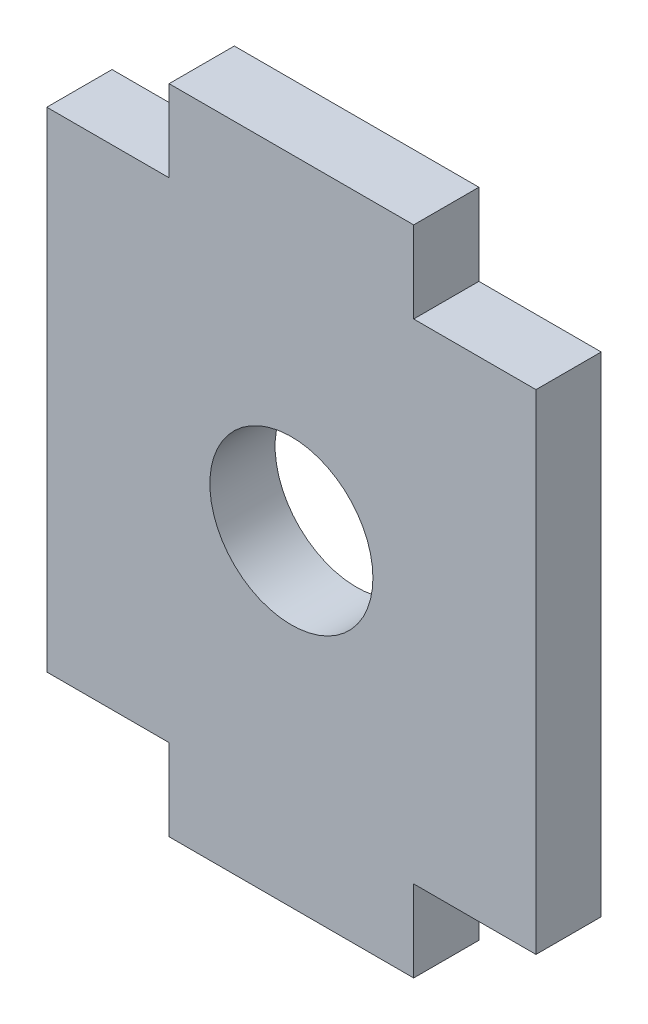
ISO-10303-21;
HEADER;
FILE_DESCRIPTION(('STEP AP214'),'2;1');
FILE_NAME('part.step','',(''),(''),'','','');
FILE_SCHEMA(('AUTOMOTIVE_DESIGN { 1 0 10303 214 1 1 1 1 }'));
ENDSEC;
DATA;
#1=APPLICATION_CONTEXT('core data for automotive mechanical design processes');
#2=APPLICATION_PROTOCOL_DEFINITION('international standard','automotive_design',2000,#1);
#3=PRODUCT_CONTEXT('',#1,'mechanical');
#4=PRODUCT('Part','Part','',(#3));
#5=PRODUCT_RELATED_PRODUCT_CATEGORY('part','',(#4));
#6=PRODUCT_DEFINITION_FORMATION('','',#4);
#7=PRODUCT_DEFINITION_CONTEXT('part definition',#1,'design');
#8=PRODUCT_DEFINITION('design','',#6,#7);
#9=PRODUCT_DEFINITION_SHAPE('','',#8);
#10=(LENGTH_UNIT() NAMED_UNIT(*) SI_UNIT(.MILLI.,.METRE.));
#11=(NAMED_UNIT(*) PLANE_ANGLE_UNIT() SI_UNIT($,.RADIAN.));
#12=(NAMED_UNIT(*) SI_UNIT($,.STERADIAN.) SOLID_ANGLE_UNIT());
#13=UNCERTAINTY_MEASURE_WITH_UNIT(LENGTH_MEASURE(1.E-05),#10,'distance_accuracy_value','');
#14=(GEOMETRIC_REPRESENTATION_CONTEXT(3) GLOBAL_UNCERTAINTY_ASSIGNED_CONTEXT((#13)) GLOBAL_UNIT_ASSIGNED_CONTEXT((#10,
#11,#12)) REPRESENTATION_CONTEXT('',''));
#15=CARTESIAN_POINT('',(0.,0.,0.));
#16=DIRECTION('',(0.,0.,1.));
#17=DIRECTION('',(1.,0.,0.));
#18=AXIS2_PLACEMENT_3D('',#15,#16,#17);
#19=CARTESIAN_POINT('',(-7.5,-15.,4.));
#20=DIRECTION('',(1.,0.,0.));
#21=DIRECTION('',(0.,1.,0.));
#22=AXIS2_PLACEMENT_3D('',#19,#20,#21);
#23=PLANE('',#22);
#24=DIRECTION('',(0.,-1.,0.));
#25=VECTOR('',#24,1.);
#26=CARTESIAN_POINT('',(-7.5,-15.,0.));
#27=LINE('',#26,#25);
#28=CARTESIAN_POINT('',(-7.5,-15.,0.));
#29=VERTEX_POINT('',#28);
#30=CARTESIAN_POINT('',(-7.5,-20.,0.));
#31=VERTEX_POINT('',#30);
#32=EDGE_CURVE('E163',#29,#31,#27,.T.);
#33=ORIENTED_EDGE('',*,*,#32,.T.);
#34=DIRECTION('',(0.,0.,-1.));
#35=VECTOR('',#34,1.);
#36=CARTESIAN_POINT('',(-7.5,-20.,4.));
#37=LINE('',#36,#35);
#38=CARTESIAN_POINT('',(-7.5,-20.,4.));
#39=VERTEX_POINT('',#38);
#40=EDGE_CURVE('E11',#39,#31,#37,.T.);
#41=ORIENTED_EDGE('',*,*,#40,.F.);
#42=DIRECTION('',(0.,-1.,0.));
#43=VECTOR('',#42,1.);
#44=CARTESIAN_POINT('',(-7.5,-15.,4.));
#45=LINE('',#44,#43);
#46=CARTESIAN_POINT('',(-7.5,-15.,4.));
#47=VERTEX_POINT('',#46);
#48=EDGE_CURVE('E198',#47,#39,#45,.T.);
#49=ORIENTED_EDGE('',*,*,#48,.F.);
#50=DIRECTION('',(0.,0.,-1.));
#51=VECTOR('',#50,1.);
#52=CARTESIAN_POINT('',(-7.5,-15.,4.));
#53=LINE('',#52,#51);
#54=EDGE_CURVE('E159',#47,#29,#53,.T.);
#55=ORIENTED_EDGE('',*,*,#54,.T.);
#56=EDGE_LOOP('',(#33,#41,#49,#55));
#57=FACE_BOUND('',#56,.T.);
#58=ADVANCED_FACE('F38',(#57),#23,.F.);
#59=CARTESIAN_POINT('',(7.5,-20.,4.));
#60=DIRECTION('',(0.,1.,0.));
#61=DIRECTION('',(0.,0.,1.));
#62=AXIS2_PLACEMENT_3D('',#59,#60,#61);
#63=PLANE('',#62);
#64=DIRECTION('',(1.,0.,0.));
#65=VECTOR('',#64,1.);
#66=CARTESIAN_POINT('',(7.5,-20.,0.));
#67=LINE('',#66,#65);
#68=CARTESIAN_POINT('',(7.5,-20.,0.));
#69=VERTEX_POINT('',#68);
#70=EDGE_CURVE('E167',#31,#69,#67,.T.);
#71=ORIENTED_EDGE('',*,*,#70,.T.);
#72=DIRECTION('',(0.,0.,-1.));
#73=VECTOR('',#72,1.);
#74=CARTESIAN_POINT('',(7.5,-20.,4.));
#75=LINE('',#74,#73);
#76=CARTESIAN_POINT('',(7.5,-20.,4.));
#77=VERTEX_POINT('',#76);
#78=EDGE_CURVE('E47',#77,#69,#75,.T.);
#79=ORIENTED_EDGE('',*,*,#78,.F.);
#80=DIRECTION('',(1.,0.,0.));
#81=VECTOR('',#80,1.);
#82=CARTESIAN_POINT('',(7.5,-20.,4.));
#83=LINE('',#82,#81);
#84=EDGE_CURVE('E110',#39,#77,#83,.T.);
#85=ORIENTED_EDGE('',*,*,#84,.F.);
#86=ORIENTED_EDGE('',*,*,#40,.T.);
#87=EDGE_LOOP('',(#71,#79,#85,#86));
#88=FACE_BOUND('',#87,.T.);
#89=ADVANCED_FACE('F294',(#88),#63,.F.);
#90=CARTESIAN_POINT('',(7.5,-15.,4.));
#91=DIRECTION('',(-1.,0.,0.));
#92=DIRECTION('',(0.,0.,1.));
#93=AXIS2_PLACEMENT_3D('',#90,#91,#92);
#94=PLANE('',#93);
#95=DIRECTION('',(0.,1.,0.));
#96=VECTOR('',#95,1.);
#97=CARTESIAN_POINT('',(7.5,-15.,0.));
#98=LINE('',#97,#96);
#99=CARTESIAN_POINT('',(7.5,-15.,0.));
#100=VERTEX_POINT('',#99);
#101=EDGE_CURVE('E171',#69,#100,#98,.T.);
#102=ORIENTED_EDGE('',*,*,#101,.T.);
#103=DIRECTION('',(0.,0.,-1.));
#104=VECTOR('',#103,1.);
#105=CARTESIAN_POINT('',(7.5,-15.,4.));
#106=LINE('',#105,#104);
#107=CARTESIAN_POINT('',(7.5,-15.,4.));
#108=VERTEX_POINT('',#107);
#109=EDGE_CURVE('E225',#108,#100,#106,.T.);
#110=ORIENTED_EDGE('',*,*,#109,.F.);
#111=DIRECTION('',(0.,1.,0.));
#112=VECTOR('',#111,1.);
#113=CARTESIAN_POINT('',(7.5,-15.,4.));
#114=LINE('',#113,#112);
#115=EDGE_CURVE('E235',#77,#108,#114,.T.);
#116=ORIENTED_EDGE('',*,*,#115,.F.);
#117=ORIENTED_EDGE('',*,*,#78,.T.);
#118=EDGE_LOOP('',(#102,#110,#116,#117));
#119=FACE_BOUND('',#118,.T.);
#120=ADVANCED_FACE('F233',(#119),#94,.F.);
#121=CARTESIAN_POINT('',(15.,-15.,4.));
#122=DIRECTION('',(0.,1.,0.));
#123=DIRECTION('',(-1.,0.,0.));
#124=AXIS2_PLACEMENT_3D('',#121,#122,#123);
#125=PLANE('',#124);
#126=DIRECTION('',(1.,0.,0.));
#127=VECTOR('',#126,1.);
#128=CARTESIAN_POINT('',(15.,-15.,0.));
#129=LINE('',#128,#127);
#130=CARTESIAN_POINT('',(15.,-15.,0.));
#131=VERTEX_POINT('',#130);
#132=EDGE_CURVE('E174',#100,#131,#129,.T.);
#133=ORIENTED_EDGE('',*,*,#132,.T.);
#134=DIRECTION('',(0.,0.,-1.));
#135=VECTOR('',#134,1.);
#136=CARTESIAN_POINT('',(15.,-15.,4.));
#137=LINE('',#136,#135);
#138=CARTESIAN_POINT('',(15.,-15.,4.));
#139=VERTEX_POINT('',#138);
#140=EDGE_CURVE('E221',#139,#131,#137,.T.);
#141=ORIENTED_EDGE('',*,*,#140,.F.);
#142=DIRECTION('',(1.,0.,0.));
#143=VECTOR('',#142,1.);
#144=CARTESIAN_POINT('',(15.,-15.,4.));
#145=LINE('',#144,#143);
#146=EDGE_CURVE('E254',#108,#139,#145,.T.);
#147=ORIENTED_EDGE('',*,*,#146,.F.);
#148=ORIENTED_EDGE('',*,*,#109,.T.);
#149=EDGE_LOOP('',(#133,#141,#147,#148));
#150=FACE_BOUND('',#149,.T.);
#151=ADVANCED_FACE('F244',(#150),#125,.F.);
#152=CARTESIAN_POINT('',(15.,-15.,4.));
#153=DIRECTION('',(-1.,0.,0.));
#154=DIRECTION('',(0.,0.,1.));
#155=AXIS2_PLACEMENT_3D('',#152,#153,#154);
#156=PLANE('',#155);
#157=DIRECTION('',(0.,1.,0.));
#158=VECTOR('',#157,1.);
#159=CARTESIAN_POINT('',(15.,-15.,0.));
#160=LINE('',#159,#158);
#161=CARTESIAN_POINT('',(15.,15.,0.));
#162=VERTEX_POINT('',#161);
#163=EDGE_CURVE('E177',#131,#162,#160,.T.);
#164=ORIENTED_EDGE('',*,*,#163,.T.);
#165=DIRECTION('',(0.,0.,-1.));
#166=VECTOR('',#165,1.);
#167=CARTESIAN_POINT('',(15.,15.,4.));
#168=LINE('',#167,#166);
#169=CARTESIAN_POINT('',(15.,15.,4.));
#170=VERTEX_POINT('',#169);
#171=EDGE_CURVE('E217',#170,#162,#168,.T.);
#172=ORIENTED_EDGE('',*,*,#171,.F.);
#173=DIRECTION('',(0.,1.,0.));
#174=VECTOR('',#173,1.);
#175=CARTESIAN_POINT('',(15.,-15.,4.));
#176=LINE('',#175,#174);
#177=EDGE_CURVE('E250',#139,#170,#176,.T.);
#178=ORIENTED_EDGE('',*,*,#177,.F.);
#179=ORIENTED_EDGE('',*,*,#140,.T.);
#180=EDGE_LOOP('',(#164,#172,#178,#179));
#181=FACE_BOUND('',#180,.T.);
#182=ADVANCED_FACE('F248',(#181),#156,.F.);
#183=CARTESIAN_POINT('',(15.,15.,4.));
#184=DIRECTION('',(0.,-1.,0.));
#185=DIRECTION('',(0.,0.,-1.));
#186=AXIS2_PLACEMENT_3D('',#183,#184,#185);
#187=PLANE('',#186);
#188=DIRECTION('',(-1.,0.,0.));
#189=VECTOR('',#188,1.);
#190=CARTESIAN_POINT('',(15.,15.,0.));
#191=LINE('',#190,#189);
#192=CARTESIAN_POINT('',(7.5,15.,0.));
#193=VERTEX_POINT('',#192);
#194=EDGE_CURVE('E180',#162,#193,#191,.T.);
#195=ORIENTED_EDGE('',*,*,#194,.T.);
#196=DIRECTION('',(0.,0.,-1.));
#197=VECTOR('',#196,1.);
#198=CARTESIAN_POINT('',(7.5,15.,4.));
#199=LINE('',#198,#197);
#200=CARTESIAN_POINT('',(7.5,15.,4.));
#201=VERTEX_POINT('',#200);
#202=EDGE_CURVE('E213',#201,#193,#199,.T.);
#203=ORIENTED_EDGE('',*,*,#202,.F.);
#204=DIRECTION('',(-1.,0.,0.));
#205=VECTOR('',#204,1.);
#206=CARTESIAN_POINT('',(15.,15.,4.));
#207=LINE('',#206,#205);
#208=EDGE_CURVE('E253',#170,#201,#207,.T.);
#209=ORIENTED_EDGE('',*,*,#208,.F.);
#210=ORIENTED_EDGE('',*,*,#171,.T.);
#211=EDGE_LOOP('',(#195,#203,#209,#210));
#212=FACE_BOUND('',#211,.T.);
#213=ADVANCED_FACE('F307',(#212),#187,.F.);
#214=CARTESIAN_POINT('',(7.5,20.,4.));
#215=DIRECTION('',(-1.,0.,0.));
#216=DIRECTION('',(0.,-1.,0.));
#217=AXIS2_PLACEMENT_3D('',#214,#215,#216);
#218=PLANE('',#217);
#219=DIRECTION('',(0.,1.,0.));
#220=VECTOR('',#219,1.);
#221=CARTESIAN_POINT('',(7.5,20.,0.));
#222=LINE('',#221,#220);
#223=CARTESIAN_POINT('',(7.5,20.,0.));
#224=VERTEX_POINT('',#223);
#225=EDGE_CURVE('E183',#193,#224,#222,.T.);
#226=ORIENTED_EDGE('',*,*,#225,.T.);
#227=DIRECTION('',(0.,0.,-1.));
#228=VECTOR('',#227,1.);
#229=CARTESIAN_POINT('',(7.5,20.,4.));
#230=LINE('',#229,#228);
#231=CARTESIAN_POINT('',(7.5,20.,4.));
#232=VERTEX_POINT('',#231);
#233=EDGE_CURVE('E209',#232,#224,#230,.T.);
#234=ORIENTED_EDGE('',*,*,#233,.F.);
#235=DIRECTION('',(0.,1.,0.));
#236=VECTOR('',#235,1.);
#237=CARTESIAN_POINT('',(7.5,20.,4.));
#238=LINE('',#237,#236);
#239=EDGE_CURVE('E258',#201,#232,#238,.T.);
#240=ORIENTED_EDGE('',*,*,#239,.F.);
#241=ORIENTED_EDGE('',*,*,#202,.T.);
#242=EDGE_LOOP('',(#226,#234,#240,#241));
#243=FACE_BOUND('',#242,.T.);
#244=ADVANCED_FACE('F310',(#243),#218,.F.);
#245=CARTESIAN_POINT('',(7.5,20.,4.));
#246=DIRECTION('',(0.,-1.,0.));
#247=DIRECTION('',(1.,0.,0.));
#248=AXIS2_PLACEMENT_3D('',#245,#246,#247);
#249=PLANE('',#248);
#250=DIRECTION('',(-1.,0.,0.));
#251=VECTOR('',#250,1.);
#252=CARTESIAN_POINT('',(7.5,20.,0.));
#253=LINE('',#252,#251);
#254=CARTESIAN_POINT('',(-7.5,20.,0.));
#255=VERTEX_POINT('',#254);
#256=EDGE_CURVE('E186',#224,#255,#253,.T.);
#257=ORIENTED_EDGE('',*,*,#256,.T.);
#258=DIRECTION('',(0.,0.,-1.));
#259=VECTOR('',#258,1.);
#260=CARTESIAN_POINT('',(-7.5,20.,4.));
#261=LINE('',#260,#259);
#262=CARTESIAN_POINT('',(-7.5,20.,4.));
#263=VERTEX_POINT('',#262);
#264=EDGE_CURVE('E205',#263,#255,#261,.T.);
#265=ORIENTED_EDGE('',*,*,#264,.F.);
#266=DIRECTION('',(-1.,0.,0.));
#267=VECTOR('',#266,1.);
#268=CARTESIAN_POINT('',(7.5,20.,4.));
#269=LINE('',#268,#267);
#270=EDGE_CURVE('E265',#232,#263,#269,.T.);
#271=ORIENTED_EDGE('',*,*,#270,.F.);
#272=ORIENTED_EDGE('',*,*,#233,.T.);
#273=EDGE_LOOP('',(#257,#265,#271,#272));
#274=FACE_BOUND('',#273,.T.);
#275=ADVANCED_FACE('F273',(#274),#249,.F.);
#276=CARTESIAN_POINT('',(-7.5,20.,4.));
#277=DIRECTION('',(1.,0.,0.));
#278=DIRECTION('',(0.,0.,-1.));
#279=AXIS2_PLACEMENT_3D('',#276,#277,#278);
#280=PLANE('',#279);
#281=DIRECTION('',(0.,-1.,0.));
#282=VECTOR('',#281,1.);
#283=CARTESIAN_POINT('',(-7.5,20.,0.));
#284=LINE('',#283,#282);
#285=CARTESIAN_POINT('',(-7.5,15.,0.));
#286=VERTEX_POINT('',#285);
#287=EDGE_CURVE('E189',#255,#286,#284,.T.);
#288=ORIENTED_EDGE('',*,*,#287,.T.);
#289=DIRECTION('',(0.,0.,-1.));
#290=VECTOR('',#289,1.);
#291=CARTESIAN_POINT('',(-7.5,15.,4.));
#292=LINE('',#291,#290);
#293=CARTESIAN_POINT('',(-7.5,15.,4.));
#294=VERTEX_POINT('',#293);
#295=EDGE_CURVE('E152',#294,#286,#292,.T.);
#296=ORIENTED_EDGE('',*,*,#295,.F.);
#297=DIRECTION('',(0.,-1.,0.));
#298=VECTOR('',#297,1.);
#299=CARTESIAN_POINT('',(-7.5,20.,4.));
#300=LINE('',#299,#298);
#301=EDGE_CURVE('E141',#263,#294,#300,.T.);
#302=ORIENTED_EDGE('',*,*,#301,.F.);
#303=ORIENTED_EDGE('',*,*,#264,.T.);
#304=EDGE_LOOP('',(#288,#296,#302,#303));
#305=FACE_BOUND('',#304,.T.);
#306=ADVANCED_FACE('F277',(#305),#280,.F.);
#307=CARTESIAN_POINT('',(-7.5,15.,4.));
#308=DIRECTION('',(0.,-1.,0.));
#309=DIRECTION('',(1.,0.,0.));
#310=AXIS2_PLACEMENT_3D('',#307,#308,#309);
#311=PLANE('',#310);
#312=DIRECTION('',(-1.,0.,0.));
#313=VECTOR('',#312,1.);
#314=CARTESIAN_POINT('',(-7.5,15.,0.));
#315=LINE('',#314,#313);
#316=CARTESIAN_POINT('',(-15.,15.,0.));
#317=VERTEX_POINT('',#316);
#318=EDGE_CURVE('E150',#286,#317,#315,.T.);
#319=ORIENTED_EDGE('',*,*,#318,.T.);
#320=DIRECTION('',(0.,0.,-1.));
#321=VECTOR('',#320,1.);
#322=CARTESIAN_POINT('',(-15.,15.,4.));
#323=LINE('',#322,#321);
#324=CARTESIAN_POINT('',(-15.,15.,4.));
#325=VERTEX_POINT('',#324);
#326=EDGE_CURVE('E147',#325,#317,#323,.T.);
#327=ORIENTED_EDGE('',*,*,#326,.F.);
#328=DIRECTION('',(-1.,0.,0.));
#329=VECTOR('',#328,1.);
#330=CARTESIAN_POINT('',(-7.5,15.,4.));
#331=LINE('',#330,#329);
#332=EDGE_CURVE('E135',#294,#325,#331,.T.);
#333=ORIENTED_EDGE('',*,*,#332,.F.);
#334=ORIENTED_EDGE('',*,*,#295,.T.);
#335=EDGE_LOOP('',(#319,#327,#333,#334));
#336=FACE_BOUND('',#335,.T.);
#337=ADVANCED_FACE('F148',(#336),#311,.F.);
#338=CARTESIAN_POINT('',(-15.,-15.,4.));
#339=DIRECTION('',(1.,0.,0.));
#340=DIRECTION('',(0.,0.,-1.));
#341=AXIS2_PLACEMENT_3D('',#338,#339,#340);
#342=PLANE('',#341);
#343=DIRECTION('',(0.,-1.,0.));
#344=VECTOR('',#343,1.);
#345=CARTESIAN_POINT('',(-15.,-15.,0.));
#346=LINE('',#345,#344);
#347=CARTESIAN_POINT('',(-15.,-15.,0.));
#348=VERTEX_POINT('',#347);
#349=EDGE_CURVE('E96',#317,#348,#346,.T.);
#350=ORIENTED_EDGE('',*,*,#349,.T.);
#351=DIRECTION('',(0.,0.,-1.));
#352=VECTOR('',#351,1.);
#353=CARTESIAN_POINT('',(-15.,-15.,4.));
#354=LINE('',#353,#352);
#355=CARTESIAN_POINT('',(-15.,-15.,4.));
#356=VERTEX_POINT('',#355);
#357=EDGE_CURVE('E153',#356,#348,#354,.T.);
#358=ORIENTED_EDGE('',*,*,#357,.F.);
#359=DIRECTION('',(0.,-1.,0.));
#360=VECTOR('',#359,1.);
#361=CARTESIAN_POINT('',(-15.,-15.,4.));
#362=LINE('',#361,#360);
#363=EDGE_CURVE('E139',#325,#356,#362,.T.);
#364=ORIENTED_EDGE('',*,*,#363,.F.);
#365=ORIENTED_EDGE('',*,*,#326,.T.);
#366=EDGE_LOOP('',(#350,#358,#364,#365));
#367=FACE_BOUND('',#366,.T.);
#368=ADVANCED_FACE('F155',(#367),#342,.F.);
#369=CARTESIAN_POINT('',(-7.5,-15.,4.));
#370=DIRECTION('',(0.,1.,0.));
#371=DIRECTION('',(-1.,0.,0.));
#372=AXIS2_PLACEMENT_3D('',#369,#370,#371);
#373=PLANE('',#372);
#374=DIRECTION('',(1.,0.,0.));
#375=VECTOR('',#374,1.);
#376=CARTESIAN_POINT('',(-7.5,-15.,0.));
#377=LINE('',#376,#375);
#378=EDGE_CURVE('E102',#348,#29,#377,.T.);
#379=ORIENTED_EDGE('',*,*,#378,.T.);
#380=ORIENTED_EDGE('',*,*,#54,.F.);
#381=DIRECTION('',(1.,0.,0.));
#382=VECTOR('',#381,1.);
#383=CARTESIAN_POINT('',(-7.5,-15.,4.));
#384=LINE('',#383,#382);
#385=EDGE_CURVE('E55',#356,#47,#384,.T.);
#386=ORIENTED_EDGE('',*,*,#385,.F.);
#387=ORIENTED_EDGE('',*,*,#357,.T.);
#388=EDGE_LOOP('',(#379,#380,#386,#387));
#389=FACE_BOUND('',#388,.T.);
#390=ADVANCED_FACE('F281',(#389),#373,.F.);
#391=CARTESIAN_POINT('',(0.,0.,4.));
#392=DIRECTION('',(0.,0.,-1.));
#393=DIRECTION('',(-1.,0.,0.));
#394=AXIS2_PLACEMENT_3D('',#391,#392,#393);
#395=PLANE('',#394);
#396=CARTESIAN_POINT('',(0.,0.,4.));
#397=DIRECTION('',(0.,0.,1.));
#398=DIRECTION('',(1.,0.,0.));
#399=AXIS2_PLACEMENT_3D('',#396,#397,#398);
#400=CIRCLE('',#399,5.);
#401=CARTESIAN_POINT('',(5.,0.,4.));
#402=VERTEX_POINT('',#401);
#403=EDGE_CURVE('E364',#402,#402,#400,.T.);
#404=ORIENTED_EDGE('',*,*,#403,.F.);
#405=EDGE_LOOP('',(#404));
#406=FACE_BOUND('',#405,.T.);
#407=ORIENTED_EDGE('',*,*,#48,.T.);
#408=ORIENTED_EDGE('',*,*,#84,.T.);
#409=ORIENTED_EDGE('',*,*,#115,.T.);
#410=ORIENTED_EDGE('',*,*,#146,.T.);
#411=ORIENTED_EDGE('',*,*,#177,.T.);
#412=ORIENTED_EDGE('',*,*,#208,.T.);
#413=ORIENTED_EDGE('',*,*,#239,.T.);
#414=ORIENTED_EDGE('',*,*,#270,.T.);
#415=ORIENTED_EDGE('',*,*,#301,.T.);
#416=ORIENTED_EDGE('',*,*,#332,.T.);
#417=ORIENTED_EDGE('',*,*,#363,.T.);
#418=ORIENTED_EDGE('',*,*,#385,.T.);
#419=EDGE_LOOP('',(#407,#408,#409,#410,#411,#412,#413,#414,#415,#416,#417,#418));
#420=FACE_BOUND('',#419,.T.);
#421=ADVANCED_FACE('F137',(#406,#420),#395,.F.);
#422=CARTESIAN_POINT('',(0.,0.,0.));
#423=DIRECTION('',(0.,0.,-1.));
#424=DIRECTION('',(-1.,0.,0.));
#425=AXIS2_PLACEMENT_3D('',#422,#423,#424);
#426=PLANE('',#425);
#427=CARTESIAN_POINT('',(0.,0.,0.));
#428=DIRECTION('',(0.,0.,1.));
#429=DIRECTION('',(1.,0.,0.));
#430=AXIS2_PLACEMENT_3D('',#427,#428,#429);
#431=CIRCLE('',#430,5.);
#432=CARTESIAN_POINT('',(5.,0.,0.));
#433=VERTEX_POINT('',#432);
#434=EDGE_CURVE('E168',#433,#433,#431,.T.);
#435=ORIENTED_EDGE('',*,*,#434,.T.);
#436=EDGE_LOOP('',(#435));
#437=FACE_BOUND('',#436,.T.);
#438=ORIENTED_EDGE('',*,*,#32,.F.);
#439=ORIENTED_EDGE('',*,*,#378,.F.);
#440=ORIENTED_EDGE('',*,*,#349,.F.);
#441=ORIENTED_EDGE('',*,*,#318,.F.);
#442=ORIENTED_EDGE('',*,*,#287,.F.);
#443=ORIENTED_EDGE('',*,*,#256,.F.);
#444=ORIENTED_EDGE('',*,*,#225,.F.);
#445=ORIENTED_EDGE('',*,*,#194,.F.);
#446=ORIENTED_EDGE('',*,*,#163,.F.);
#447=ORIENTED_EDGE('',*,*,#132,.F.);
#448=ORIENTED_EDGE('',*,*,#101,.F.);
#449=ORIENTED_EDGE('',*,*,#70,.F.);
#450=EDGE_LOOP('',(#438,#439,#440,#441,#442,#443,#444,#445,#446,#447,#448,#449));
#451=FACE_BOUND('',#450,.T.);
#452=ADVANCED_FACE('F239',(#437,#451),#426,.T.);
#453=CARTESIAN_POINT('',(0.,0.,0.));
#454=DIRECTION('',(0.,0.,1.));
#455=DIRECTION('',(1.,0.,0.));
#456=AXIS2_PLACEMENT_3D('',#453,#454,#455);
#457=CYLINDRICAL_SURFACE('',#456,5.);
#458=ORIENTED_EDGE('',*,*,#434,.F.);
#459=EDGE_LOOP('',(#458));
#460=FACE_BOUND('',#459,.T.);
#461=ORIENTED_EDGE('',*,*,#403,.T.);
#462=EDGE_LOOP('',(#461));
#463=FACE_BOUND('',#462,.T.);
#464=ADVANCED_FACE('F343',(#460,#463),#457,.F.);
#465=CLOSED_SHELL('',(#58,#89,#120,#151,#182,#213,#244,#275,#306,#337,#368,#390,#421,#452,#464));
#466=MANIFOLD_SOLID_BREP('B2',#465);
#467=ADVANCED_BREP_SHAPE_REPRESENTATION('',(#18,#466),#14);
#468=SHAPE_DEFINITION_REPRESENTATION(#9,#467);
ENDSEC;
END-ISO-10303-21;
